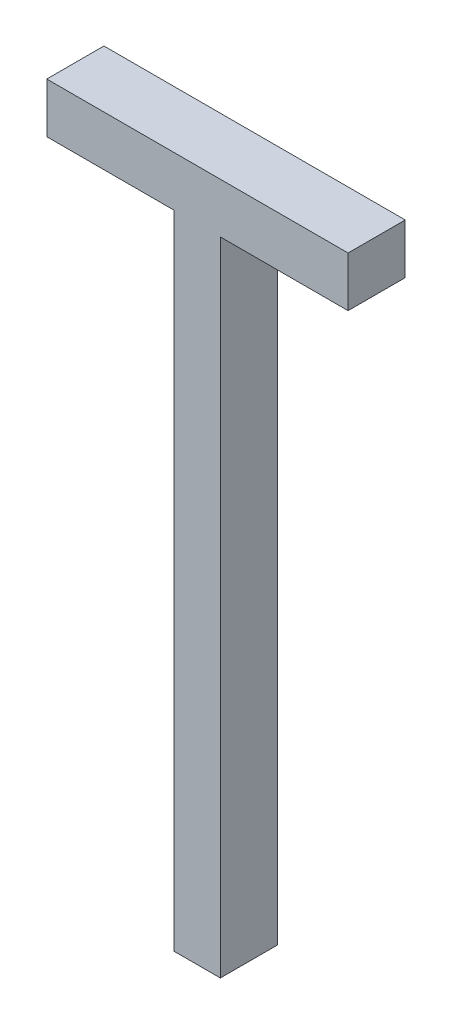
ISO-10303-21;
HEADER;
FILE_DESCRIPTION(('STEP AP214'),'2;1');
FILE_NAME('part.step','',(''),(''),'','','');
FILE_SCHEMA(('AUTOMOTIVE_DESIGN { 1 0 10303 214 1 1 1 1 }'));
ENDSEC;
DATA;
#1=APPLICATION_CONTEXT('core data for automotive mechanical design processes');
#2=APPLICATION_PROTOCOL_DEFINITION('international standard','automotive_design',2000,#1);
#3=PRODUCT_CONTEXT('',#1,'mechanical');
#4=PRODUCT('Part','Part','',(#3));
#5=PRODUCT_RELATED_PRODUCT_CATEGORY('part','',(#4));
#6=PRODUCT_DEFINITION_FORMATION('','',#4);
#7=PRODUCT_DEFINITION_CONTEXT('part definition',#1,'design');
#8=PRODUCT_DEFINITION('design','',#6,#7);
#9=PRODUCT_DEFINITION_SHAPE('','',#8);
#10=(LENGTH_UNIT() NAMED_UNIT(*) SI_UNIT(.MILLI.,.METRE.));
#11=(NAMED_UNIT(*) PLANE_ANGLE_UNIT() SI_UNIT($,.RADIAN.));
#12=(NAMED_UNIT(*) SI_UNIT($,.STERADIAN.) SOLID_ANGLE_UNIT());
#13=UNCERTAINTY_MEASURE_WITH_UNIT(LENGTH_MEASURE(1.E-05),#10,'distance_accuracy_value','');
#14=(GEOMETRIC_REPRESENTATION_CONTEXT(3) GLOBAL_UNCERTAINTY_ASSIGNED_CONTEXT((#13)) GLOBAL_UNIT_ASSIGNED_CONTEXT((#10,
#11,#12)) REPRESENTATION_CONTEXT('',''));
#15=CARTESIAN_POINT('',(0.,0.,0.));
#16=DIRECTION('',(0.,0.,1.));
#17=DIRECTION('',(1.,0.,0.));
#18=AXIS2_PLACEMENT_3D('',#15,#16,#17);
#19=CARTESIAN_POINT('',(32.4987556930743,0.,40.));
#20=DIRECTION('',(1.,0.,0.));
#21=DIRECTION('',(0.,0.,-1.));
#22=AXIS2_PLACEMENT_3D('',#19,#20,#21);
#23=PLANE('',#22);
#24=DIRECTION('',(0.,-1.,0.));
#25=VECTOR('',#24,1.);
#26=CARTESIAN_POINT('',(32.4987556930743,0.,0.));
#27=LINE('',#26,#25);
#28=CARTESIAN_POINT('',(32.4987556930743,77.210405036148,0.));
#29=VERTEX_POINT('',#28);
#30=CARTESIAN_POINT('',(32.4987556930743,-371.749599671688,0.));
#31=VERTEX_POINT('',#30);
#32=EDGE_CURVE('E138',#29,#31,#27,.T.);
#33=ORIENTED_EDGE('',*,*,#32,.F.);
#34=DIRECTION('',(0.,0.,-1.));
#35=VECTOR('',#34,1.);
#36=CARTESIAN_POINT('',(32.4987556930743,77.210405036148,40.));
#37=LINE('',#36,#35);
#38=CARTESIAN_POINT('',(32.4987556930743,77.210405036148,40.));
#39=VERTEX_POINT('',#38);
#40=EDGE_CURVE('E11',#39,#29,#37,.T.);
#41=ORIENTED_EDGE('',*,*,#40,.F.);
#42=DIRECTION('',(0.,-1.,0.));
#43=VECTOR('',#42,1.);
#44=CARTESIAN_POINT('',(32.4987556930743,0.,40.));
#45=LINE('',#44,#43);
#46=CARTESIAN_POINT('',(32.4987556930743,-371.749599671688,40.));
#47=VERTEX_POINT('',#46);
#48=EDGE_CURVE('E152',#39,#47,#45,.T.);
#49=ORIENTED_EDGE('',*,*,#48,.T.);
#50=DIRECTION('',(0.,0.,-1.));
#51=VECTOR('',#50,1.);
#52=CARTESIAN_POINT('',(32.4987556930743,-371.749599671688,40.));
#53=LINE('',#52,#51);
#54=EDGE_CURVE('E153',#47,#31,#53,.T.);
#55=ORIENTED_EDGE('',*,*,#54,.T.);
#56=EDGE_LOOP('',(#33,#41,#49,#55));
#57=FACE_BOUND('',#56,.T.);
#58=ADVANCED_FACE('F37',(#57),#23,.T.);
#59=CARTESIAN_POINT('',(0.,0.,40.));
#60=DIRECTION('',(1.,0.,0.));
#61=DIRECTION('',(0.,0.,-1.));
#62=AXIS2_PLACEMENT_3D('',#59,#60,#61);
#63=PLANE('',#62);
#64=DIRECTION('',(0.,-1.,0.));
#65=VECTOR('',#64,1.);
#66=CARTESIAN_POINT('',(0.,0.,0.));
#67=LINE('',#66,#65);
#68=CARTESIAN_POINT('',(0.,77.210405036148,0.));
#69=VERTEX_POINT('',#68);
#70=CARTESIAN_POINT('',(0.,-371.749599671688,0.));
#71=VERTEX_POINT('',#70);
#72=EDGE_CURVE('E123',#69,#71,#67,.T.);
#73=ORIENTED_EDGE('',*,*,#72,.T.);
#74=DIRECTION('',(0.,0.,-1.));
#75=VECTOR('',#74,1.);
#76=CARTESIAN_POINT('',(0.,-371.749599671688,40.));
#77=LINE('',#76,#75);
#78=CARTESIAN_POINT('',(0.,-371.749599671688,40.));
#79=VERTEX_POINT('',#78);
#80=EDGE_CURVE('E155',#79,#71,#77,.T.);
#81=ORIENTED_EDGE('',*,*,#80,.F.);
#82=DIRECTION('',(0.,-1.,0.));
#83=VECTOR('',#82,1.);
#84=CARTESIAN_POINT('',(0.,0.,40.));
#85=LINE('',#84,#83);
#86=CARTESIAN_POINT('',(0.,77.210405036148,40.));
#87=VERTEX_POINT('',#86);
#88=EDGE_CURVE('E188',#87,#79,#85,.T.);
#89=ORIENTED_EDGE('',*,*,#88,.F.);
#90=DIRECTION('',(0.,0.,-1.));
#91=VECTOR('',#90,1.);
#92=CARTESIAN_POINT('',(0.,77.210405036148,40.));
#93=LINE('',#92,#91);
#94=EDGE_CURVE('E47',#87,#69,#93,.T.);
#95=ORIENTED_EDGE('',*,*,#94,.T.);
#96=EDGE_LOOP('',(#73,#81,#89,#95));
#97=FACE_BOUND('',#96,.T.);
#98=ADVANCED_FACE('F192',(#97),#63,.F.);
#99=CARTESIAN_POINT('',(0.,-371.749599671688,40.));
#100=DIRECTION('',(0.,1.,0.));
#101=DIRECTION('',(0.,0.,1.));
#102=AXIS2_PLACEMENT_3D('',#99,#100,#101);
#103=PLANE('',#102);
#104=DIRECTION('',(1.,0.,0.));
#105=VECTOR('',#104,1.);
#106=CARTESIAN_POINT('',(0.,-371.749599671688,0.));
#107=LINE('',#106,#105);
#108=EDGE_CURVE('E145',#71,#31,#107,.T.);
#109=ORIENTED_EDGE('',*,*,#108,.T.);
#110=ORIENTED_EDGE('',*,*,#54,.F.);
#111=DIRECTION('',(1.,0.,0.));
#112=VECTOR('',#111,1.);
#113=CARTESIAN_POINT('',(0.,-371.749599671688,40.));
#114=LINE('',#113,#112);
#115=EDGE_CURVE('E56',#79,#47,#114,.T.);
#116=ORIENTED_EDGE('',*,*,#115,.F.);
#117=ORIENTED_EDGE('',*,*,#80,.T.);
#118=EDGE_LOOP('',(#109,#110,#116,#117));
#119=FACE_BOUND('',#118,.T.);
#120=ADVANCED_FACE('F194',(#119),#103,.F.);
#121=CARTESIAN_POINT('',(0.,0.,40.));
#122=DIRECTION('',(0.,0.,1.));
#123=DIRECTION('',(1.,0.,0.));
#124=AXIS2_PLACEMENT_3D('',#121,#122,#123);
#125=PLANE('',#124);
#126=ORIENTED_EDGE('',*,*,#48,.F.);
#127=DIRECTION('',(1.,0.,0.));
#128=VECTOR('',#127,1.);
#129=CARTESIAN_POINT('',(-88.9369539094707,77.210405036148,40.));
#130=LINE('',#129,#128);
#131=CARTESIAN_POINT('',(121.847632395166,77.210405036148,40.));
#132=VERTEX_POINT('',#131);
#133=EDGE_CURVE('E108',#39,#132,#130,.T.);
#134=ORIENTED_EDGE('',*,*,#133,.T.);
#135=DIRECTION('',(0.,-1.,0.));
#136=VECTOR('',#135,1.);
#137=CARTESIAN_POINT('',(121.847632395166,112.164978307943,40.));
#138=LINE('',#137,#136);
#139=CARTESIAN_POINT('',(121.847632395166,112.164978307943,40.));
#140=VERTEX_POINT('',#139);
#141=EDGE_CURVE('E160',#140,#132,#138,.T.);
#142=ORIENTED_EDGE('',*,*,#141,.F.);
#143=DIRECTION('',(1.,0.,0.));
#144=VECTOR('',#143,1.);
#145=CARTESIAN_POINT('',(-88.9369539094707,112.164978307943,40.));
#146=LINE('',#145,#144);
#147=CARTESIAN_POINT('',(-88.9369539094707,112.164978307943,40.));
#148=VERTEX_POINT('',#147);
#149=EDGE_CURVE('E161',#148,#140,#146,.T.);
#150=ORIENTED_EDGE('',*,*,#149,.F.);
#151=DIRECTION('',(0.,-1.,0.));
#152=VECTOR('',#151,1.);
#153=CARTESIAN_POINT('',(-88.9369539094707,112.164978307943,40.));
#154=LINE('',#153,#152);
#155=CARTESIAN_POINT('',(-88.9369539094707,77.210405036148,40.));
#156=VERTEX_POINT('',#155);
#157=EDGE_CURVE('E118',#148,#156,#154,.T.);
#158=ORIENTED_EDGE('',*,*,#157,.T.);
#159=EDGE_CURVE('E117',#156,#87,#130,.T.);
#160=ORIENTED_EDGE('',*,*,#159,.T.);
#161=ORIENTED_EDGE('',*,*,#88,.T.);
#162=ORIENTED_EDGE('',*,*,#115,.T.);
#163=EDGE_LOOP('',(#126,#134,#142,#150,#158,#160,#161,#162));
#164=FACE_BOUND('',#163,.T.);
#165=ADVANCED_FACE('F163',(#164),#125,.T.);
#166=CARTESIAN_POINT('',(0.,0.,0.));
#167=DIRECTION('',(0.,0.,1.));
#168=DIRECTION('',(1.,0.,0.));
#169=AXIS2_PLACEMENT_3D('',#166,#167,#168);
#170=PLANE('',#169);
#171=ORIENTED_EDGE('',*,*,#32,.T.);
#172=ORIENTED_EDGE('',*,*,#108,.F.);
#173=ORIENTED_EDGE('',*,*,#72,.F.);
#174=DIRECTION('',(1.,0.,0.));
#175=VECTOR('',#174,1.);
#176=CARTESIAN_POINT('',(-88.9369539094707,77.210405036148,0.));
#177=LINE('',#176,#175);
#178=CARTESIAN_POINT('',(-88.9369539094707,77.210405036148,0.));
#179=VERTEX_POINT('',#178);
#180=EDGE_CURVE('E114',#179,#69,#177,.T.);
#181=ORIENTED_EDGE('',*,*,#180,.F.);
#182=DIRECTION('',(0.,-1.,0.));
#183=VECTOR('',#182,1.);
#184=CARTESIAN_POINT('',(-88.9369539094707,112.164978307943,0.));
#185=LINE('',#184,#183);
#186=CARTESIAN_POINT('',(-88.9369539094707,112.164978307943,0.));
#187=VERTEX_POINT('',#186);
#188=EDGE_CURVE('E99',#187,#179,#185,.T.);
#189=ORIENTED_EDGE('',*,*,#188,.F.);
#190=DIRECTION('',(1.,0.,0.));
#191=VECTOR('',#190,1.);
#192=CARTESIAN_POINT('',(-88.9369539094707,112.164978307943,0.));
#193=LINE('',#192,#191);
#194=CARTESIAN_POINT('',(121.847632395166,112.164978307943,0.));
#195=VERTEX_POINT('',#194);
#196=EDGE_CURVE('E109',#187,#195,#193,.T.);
#197=ORIENTED_EDGE('',*,*,#196,.T.);
#198=DIRECTION('',(0.,-1.,0.));
#199=VECTOR('',#198,1.);
#200=CARTESIAN_POINT('',(121.847632395166,112.164978307943,0.));
#201=LINE('',#200,#199);
#202=CARTESIAN_POINT('',(121.847632395166,77.210405036148,0.));
#203=VERTEX_POINT('',#202);
#204=EDGE_CURVE('E124',#195,#203,#201,.T.);
#205=ORIENTED_EDGE('',*,*,#204,.T.);
#206=EDGE_CURVE('E125',#29,#203,#177,.T.);
#207=ORIENTED_EDGE('',*,*,#206,.F.);
#208=EDGE_LOOP('',(#171,#172,#173,#181,#189,#197,#205,#207));
#209=FACE_BOUND('',#208,.T.);
#210=ADVANCED_FACE('F121',(#209),#170,.F.);
#211=CARTESIAN_POINT('',(-88.9369539094707,112.164978307943,40.));
#212=DIRECTION('',(0.,1.,0.));
#213=DIRECTION('',(0.,0.,1.));
#214=AXIS2_PLACEMENT_3D('',#211,#212,#213);
#215=PLANE('',#214);
#216=ORIENTED_EDGE('',*,*,#196,.F.);
#217=DIRECTION('',(0.,0.,-1.));
#218=VECTOR('',#217,1.);
#219=CARTESIAN_POINT('',(-88.9369539094707,112.164978307943,40.));
#220=LINE('',#219,#218);
#221=EDGE_CURVE('E96',#148,#187,#220,.T.);
#222=ORIENTED_EDGE('',*,*,#221,.F.);
#223=ORIENTED_EDGE('',*,*,#149,.T.);
#224=DIRECTION('',(0.,0.,-1.));
#225=VECTOR('',#224,1.);
#226=CARTESIAN_POINT('',(121.847632395166,112.164978307943,40.));
#227=LINE('',#226,#225);
#228=EDGE_CURVE('E133',#140,#195,#227,.T.);
#229=ORIENTED_EDGE('',*,*,#228,.T.);
#230=EDGE_LOOP('',(#216,#222,#223,#229));
#231=FACE_BOUND('',#230,.T.);
#232=ADVANCED_FACE('F168',(#231),#215,.T.);
#233=CARTESIAN_POINT('',(-88.9369539094707,112.164978307943,40.));
#234=DIRECTION('',(1.,0.,0.));
#235=DIRECTION('',(0.,0.,-1.));
#236=AXIS2_PLACEMENT_3D('',#233,#234,#235);
#237=PLANE('',#236);
#238=ORIENTED_EDGE('',*,*,#188,.T.);
#239=DIRECTION('',(0.,0.,-1.));
#240=VECTOR('',#239,1.);
#241=CARTESIAN_POINT('',(-88.9369539094707,77.210405036148,40.));
#242=LINE('',#241,#240);
#243=EDGE_CURVE('E102',#156,#179,#242,.T.);
#244=ORIENTED_EDGE('',*,*,#243,.F.);
#245=ORIENTED_EDGE('',*,*,#157,.F.);
#246=ORIENTED_EDGE('',*,*,#221,.T.);
#247=EDGE_LOOP('',(#238,#244,#245,#246));
#248=FACE_BOUND('',#247,.T.);
#249=ADVANCED_FACE('F101',(#248),#237,.F.);
#250=CARTESIAN_POINT('',(121.847632395166,112.164978307943,40.));
#251=DIRECTION('',(1.,0.,0.));
#252=DIRECTION('',(0.,0.,-1.));
#253=AXIS2_PLACEMENT_3D('',#250,#251,#252);
#254=PLANE('',#253);
#255=ORIENTED_EDGE('',*,*,#204,.F.);
#256=ORIENTED_EDGE('',*,*,#228,.F.);
#257=ORIENTED_EDGE('',*,*,#141,.T.);
#258=DIRECTION('',(0.,0.,-1.));
#259=VECTOR('',#258,1.);
#260=CARTESIAN_POINT('',(121.847632395166,77.210405036148,40.));
#261=LINE('',#260,#259);
#262=EDGE_CURVE('E41',#132,#203,#261,.T.);
#263=ORIENTED_EDGE('',*,*,#262,.T.);
#264=EDGE_LOOP('',(#255,#256,#257,#263));
#265=FACE_BOUND('',#264,.T.);
#266=ADVANCED_FACE('F167',(#265),#254,.T.);
#267=CARTESIAN_POINT('',(-88.9369539094707,77.210405036148,40.));
#268=DIRECTION('',(0.,1.,0.));
#269=DIRECTION('',(0.,0.,1.));
#270=AXIS2_PLACEMENT_3D('',#267,#268,#269);
#271=PLANE('',#270);
#272=ORIENTED_EDGE('',*,*,#133,.F.);
#273=ORIENTED_EDGE('',*,*,#40,.T.);
#274=ORIENTED_EDGE('',*,*,#206,.T.);
#275=ORIENTED_EDGE('',*,*,#262,.F.);
#276=EDGE_LOOP('',(#272,#273,#274,#275));
#277=FACE_BOUND('',#276,.T.);
#278=ADVANCED_FACE('F178',(#277),#271,.F.);
#279=ORIENTED_EDGE('',*,*,#94,.F.);
#280=ORIENTED_EDGE('',*,*,#159,.F.);
#281=ORIENTED_EDGE('',*,*,#243,.T.);
#282=ORIENTED_EDGE('',*,*,#180,.T.);
#283=EDGE_LOOP('',(#279,#280,#281,#282));
#284=FACE_BOUND('',#283,.T.);
#285=ADVANCED_FACE('F39',(#284),#271,.F.);
#286=CLOSED_SHELL('',(#58,#98,#120,#165,#210,#232,#249,#266,#278,#285));
#287=MANIFOLD_SOLID_BREP('B2',#286);
#288=ADVANCED_BREP_SHAPE_REPRESENTATION('',(#18,#287),#14);
#289=SHAPE_DEFINITION_REPRESENTATION(#9,#288);
ENDSEC;
END-ISO-10303-21;
